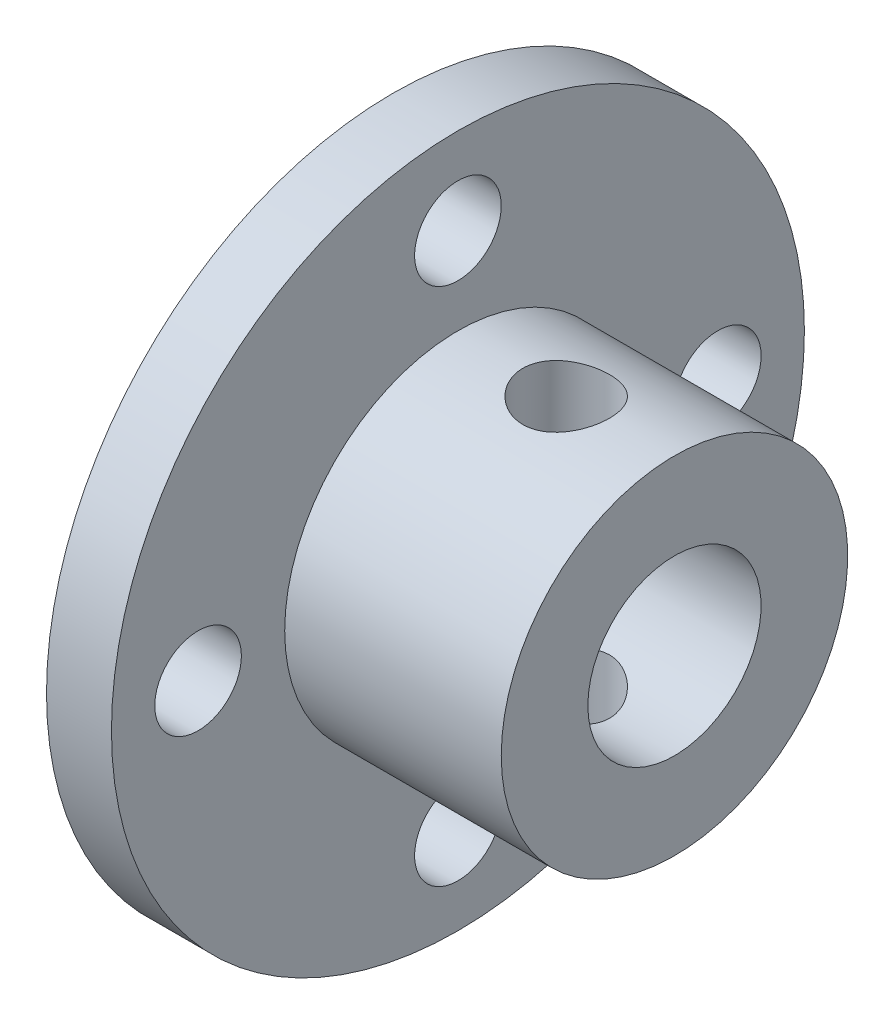
ISO-10303-21;
HEADER;
FILE_DESCRIPTION(('STEP AP214'),'2;1');
FILE_NAME('part.step','',(''),(''),'','','');
FILE_SCHEMA(('AUTOMOTIVE_DESIGN { 1 0 10303 214 1 1 1 1 }'));
ENDSEC;
DATA;
#1=APPLICATION_CONTEXT('core data for automotive mechanical design processes');
#2=APPLICATION_PROTOCOL_DEFINITION('international standard','automotive_design',2000,#1);
#3=PRODUCT_CONTEXT('',#1,'mechanical');
#4=PRODUCT('Part','Part','',(#3));
#5=PRODUCT_RELATED_PRODUCT_CATEGORY('part','',(#4));
#6=PRODUCT_DEFINITION_FORMATION('','',#4);
#7=PRODUCT_DEFINITION_CONTEXT('part definition',#1,'design');
#8=PRODUCT_DEFINITION('design','',#6,#7);
#9=PRODUCT_DEFINITION_SHAPE('','',#8);
#10=(LENGTH_UNIT() NAMED_UNIT(*) SI_UNIT(.MILLI.,.METRE.));
#11=(NAMED_UNIT(*) PLANE_ANGLE_UNIT() SI_UNIT($,.RADIAN.));
#12=(NAMED_UNIT(*) SI_UNIT($,.STERADIAN.) SOLID_ANGLE_UNIT());
#13=UNCERTAINTY_MEASURE_WITH_UNIT(LENGTH_MEASURE(1.E-05),#10,'distance_accuracy_value','');
#14=(GEOMETRIC_REPRESENTATION_CONTEXT(3) GLOBAL_UNCERTAINTY_ASSIGNED_CONTEXT((#13)) GLOBAL_UNIT_ASSIGNED_CONTEXT((#10,
#11,#12)) REPRESENTATION_CONTEXT('',''));
#15=CARTESIAN_POINT('',(0.,0.,0.));
#16=DIRECTION('',(0.,0.,1.));
#17=DIRECTION('',(1.,0.,0.));
#18=AXIS2_PLACEMENT_3D('',#15,#16,#17);
#19=CARTESIAN_POINT('',(0.,0.,0.));
#20=DIRECTION('',(-1.,0.,0.));
#21=DIRECTION('',(0.,0.,1.));
#22=AXIS2_PLACEMENT_3D('',#19,#20,#21);
#23=CYLINDRICAL_SURFACE('',#22,8.);
#24=CARTESIAN_POINT('',(3.,0.,0.));
#25=DIRECTION('',(-1.,0.,0.));
#26=DIRECTION('',(0.,0.,1.));
#27=AXIS2_PLACEMENT_3D('',#24,#25,#26);
#28=CIRCLE('',#27,8.);
#29=CARTESIAN_POINT('',(3.,0.,8.));
#30=VERTEX_POINT('',#29);
#31=EDGE_CURVE('E49',#30,#30,#28,.T.);
#32=ORIENTED_EDGE('',*,*,#31,.F.);
#33=EDGE_LOOP('',(#32));
#34=FACE_BOUND('',#33,.T.);
#35=CARTESIAN_POINT('',(13.,0.,4.44089209850063E-13));
#36=DIRECTION('',(-1.,0.,0.));
#37=DIRECTION('',(0.,0.,1.));
#38=AXIS2_PLACEMENT_3D('',#35,#36,#37);
#39=CIRCLE('',#38,8.);
#40=CARTESIAN_POINT('',(13.,0.,8.00000000000044));
#41=VERTEX_POINT('',#40);
#42=EDGE_CURVE('E104',#41,#41,#39,.T.);
#43=ORIENTED_EDGE('',*,*,#42,.T.);
#44=EDGE_LOOP('',(#43));
#45=FACE_BOUND('',#44,.T.);
#46=CARTESIAN_POINT('',(7.99999999999999,-7.74596669241484,-1.99999999999956));
#47=CARTESIAN_POINT('',(8.11044060074122,-7.74596880070287,-1.99999686287399));
#48=CARTESIAN_POINT('',(8.22091591894273,-7.74835444811688,-1.99082099639756));
#49=CARTESIAN_POINT('',(8.43869406253877,-7.75761489594063,-1.95441850037074));
#50=CARTESIAN_POINT('',(8.54599500357459,-7.76449230897306,-1.92718136539375));
#51=CARTESIAN_POINT('',(8.75424283054972,-7.7819097967692,-1.85559295970571));
#52=CARTESIAN_POINT('',(8.85519772430838,-7.79244514152373,-1.81126378228333));
#53=CARTESIAN_POINT('',(9.04824868203171,-7.81598553623014,-1.70681691300876));
#54=CARTESIAN_POINT('',(9.14034436966414,-7.82899069102793,-1.64669855084846));
#55=CARTESIAN_POINT('',(9.31508931620988,-7.85632573084501,-1.51096674184949));
#56=CARTESIAN_POINT('',(9.39751488028012,-7.87067678098435,-1.43506951016301));
#57=CARTESIAN_POINT('',(9.54860911548826,-7.89890300412242,-1.27054565127993));
#58=CARTESIAN_POINT('',(9.61727650049732,-7.91277813253111,-1.18191783534348));
#59=CARTESIAN_POINT('',(9.73982037410504,-7.93872332416466,-0.9929161608623));
#60=CARTESIAN_POINT('',(9.79347711052938,-7.95076549920481,-0.892395660955314));
#61=CARTESIAN_POINT('',(9.88304771532268,-7.97144649540795,-0.683410547433433));
#62=CARTESIAN_POINT('',(9.91896420153244,-7.98008581867479,-0.5749471086327));
#63=CARTESIAN_POINT('',(9.97131826766281,-7.99283807078543,-0.355487007002568));
#64=CARTESIAN_POINT('',(9.98813571546132,-7.99703915075451,-0.24458617563859));
#65=CARTESIAN_POINT('',(10.0030067034205,-8.0007487528584,-0.02146305540995));
#66=CARTESIAN_POINT('',(10.0010630177676,-8.00025796877365,0.0907590356305658));
#67=CARTESIAN_POINT('',(9.97874011979991,-7.99470475962829,0.310704494344771));
#68=CARTESIAN_POINT('',(9.95877093995711,-7.98974401872699,0.418472431202167));
#69=CARTESIAN_POINT('',(9.90162298396136,-7.97592669219884,0.629076494827395));
#70=CARTESIAN_POINT('',(9.86444329169803,-7.96706989918755,0.731912358740851));
#71=CARTESIAN_POINT('',(9.77359794345024,-7.94630007760716,0.930813407003751));
#72=CARTESIAN_POINT('',(9.71978636427061,-7.93436015756035,1.02680901953335));
#73=CARTESIAN_POINT('',(9.59731545670704,-7.90871923047713,1.20855124468161));
#74=CARTESIAN_POINT('',(9.52865354515147,-7.89501791721994,1.29429607017174));
#75=CARTESIAN_POINT('',(9.37623300641403,-7.86690971015617,1.45554807017066));
#76=CARTESIAN_POINT('',(9.29211608612178,-7.85249375620724,1.53071535815109));
#77=CARTESIAN_POINT('',(9.11232002116775,-7.82492034813355,1.66595275192636));
#78=CARTESIAN_POINT('',(9.01664033640704,-7.81176295284777,1.72602215209203));
#79=CARTESIAN_POINT('',(8.81576797268069,-7.78816397465319,1.82957625804527));
#80=CARTESIAN_POINT('',(8.71053141574944,-7.77773586980565,1.87297913394145));
#81=CARTESIAN_POINT('',(8.49393162553887,-7.76094912111955,1.94137124127313));
#82=CARTESIAN_POINT('',(8.38256970881343,-7.75458960648176,1.96636441310586));
#83=CARTESIAN_POINT('',(8.16003239878138,-7.74684284831313,1.99666371093218));
#84=CARTESIAN_POINT('',(8.0489297653362,-7.74532871274907,2.00247237913612));
#85=CARTESIAN_POINT('',(7.82734245073741,-7.7470987478482,1.9956135924129));
#86=CARTESIAN_POINT('',(7.71685771363894,-7.75038247681013,1.98294783827915));
#87=CARTESIAN_POINT('',(7.50150858803617,-7.76125665563649,1.93994037115011));
#88=CARTESIAN_POINT('',(7.39658181874325,-7.76877576187491,1.90989125462558));
#89=CARTESIAN_POINT('',(7.19325483371853,-7.78720574616761,1.83329446533707));
#90=CARTESIAN_POINT('',(7.09485539275556,-7.79811702598891,1.7867448381708));
#91=CARTESIAN_POINT('',(6.90524697770603,-7.82236909674612,1.67741653434998));
#92=CARTESIAN_POINT('',(6.81421692796556,-7.83575334885306,1.61433740306902));
#93=CARTESIAN_POINT('',(6.64384930975899,-7.86333666457363,1.47412058586927));
#94=CARTESIAN_POINT('',(6.56451366667992,-7.87753586182775,1.39698058961131));
#95=CARTESIAN_POINT('',(6.41775116594319,-7.90557922425286,1.2285254419699));
#96=CARTESIAN_POINT('',(6.35067194996099,-7.91940561649463,1.13690390506359));
#97=CARTESIAN_POINT('',(6.23285130643906,-7.94477773290982,0.943405365389774));
#98=CARTESIAN_POINT('',(6.18210902671342,-7.95632357603169,0.841528897915679));
#99=CARTESIAN_POINT('',(6.09884317237765,-7.97576092590652,0.631116403462718));
#100=CARTESIAN_POINT('',(6.06618857249682,-7.98367864017923,0.522634762056264));
#101=CARTESIAN_POINT('',(6.01963173231334,-7.99508234716631,0.301499520638069));
#102=CARTESIAN_POINT('',(6.00572587300875,-7.99856919514738,0.188846730082928));
#103=CARTESIAN_POINT('',(5.99726482084892,-8.00068338817614,-0.0341670528862561));
#104=CARTESIAN_POINT('',(6.00219658180928,-7.99943957759978,-0.144507653931702));
#105=CARTESIAN_POINT('',(6.03009565458877,-7.99251792914887,-0.362734992829298));
#106=CARTESIAN_POINT('',(6.05306243002629,-7.98684022314339,-0.470621803561743));
#107=CARTESIAN_POINT('',(6.11610443954176,-7.97170865707779,-0.680342071289449));
#108=CARTESIAN_POINT('',(6.15608690662899,-7.96227529004787,-0.782204989161555));
#109=CARTESIAN_POINT('',(6.25194115803935,-7.94062577827317,-0.977834106083168));
#110=CARTESIAN_POINT('',(6.30781494534095,-7.92840928277515,-1.07159928253135));
#111=CARTESIAN_POINT('',(6.43543046799227,-7.90214499360576,-1.25080385684661));
#112=CARTESIAN_POINT('',(6.50752028580793,-7.88806033883334,-1.33598997659644));
#113=CARTESIAN_POINT('',(6.66484570395497,-7.85981298114383,-1.49323004054678));
#114=CARTESIAN_POINT('',(6.75008463222236,-7.84565025934604,-1.56528065015319));
#115=CARTESIAN_POINT('',(6.93320282837885,-7.81854951691008,-1.69552405294364));
#116=CARTESIAN_POINT('',(7.03128824673059,-7.80563927346589,-1.75343323883244));
#117=CARTESIAN_POINT('',(7.23611097974978,-7.78287910989664,-1.85185379317041));
#118=CARTESIAN_POINT('',(7.34284193218774,-7.77302696466426,-1.89237781950386));
#119=CARTESIAN_POINT('',(7.5411540236703,-7.75903817501476,-1.94884505714159));
#120=CARTESIAN_POINT('',(7.63178632877227,-7.75417326007009,-1.96798634119331));
#121=CARTESIAN_POINT('',(7.81493773799538,-7.74763677165252,-1.99356458514308));
#122=CARTESIAN_POINT('',(7.90745668048881,-7.74596492578217,-2.00000262874308));
#123=CARTESIAN_POINT('',(7.99999999999999,-7.74596669241484,-1.99999999999956));
#124=B_SPLINE_CURVE_WITH_KNOTS('',3,(#46,#47,#48,#49,#50,#51,#52,#53,#54,#55,#56,#57,#58,#59,
#60,#61,#62,#63,#64,#65,#66,#67,#68,#69,#70,#71,#72,#73,#74,#75,#76,#77,#78,#79,#80,#81,#82,#83,
#84,#85,#86,#87,#88,#89,#90,#91,#92,#93,#94,#95,#96,#97,#98,#99,#100,#101,#102,#103,#104,#105,
#106,#107,#108,#109,#110,#111,#112,#113,#114,#115,#116,#117,#118,#119,#120,#121,#122,#123),
.UNSPECIFIED.,.T.,.F.,(4,2,2,2,2,2,2,2,2,2,2,2,2,2,2,2,2,2,2,2,2,2,2,2,2,2,2,2,2,2,2,2,2,2,2,2,
2,2,4),(0.,0.330981953388857,0.662156593142811,0.99290458173268,1.32366661404369,
1.66099163354396,1.9983481718394,2.34041197118387,2.68242527877727,3.01751000796287,
3.35254518932781,3.68014610151123,4.00776445379801,4.33834299403568,4.66897908375175,
5.00856373257546,5.3481642495984,5.68941145606728,6.03058560103644,6.36274859809379,
6.69488101747054,7.0215792400737,7.34831617137122,7.68146276687317,8.01466415108038,
8.35620264772253,8.69772332575631,9.03673658245535,9.37568439127227,9.70546756901979,
10.0352409390162,10.363239012478,10.691278445905,11.0271767726569,11.3631602525244,
11.7054118182897,12.0474137709606,12.3247826174463,12.6021278008238),.UNSPECIFIED.);
#125=CARTESIAN_POINT('',(7.99999999999999,-7.74596669241484,-1.99999999999956));
#126=VERTEX_POINT('',#125);
#127=EDGE_CURVE('E73',#126,#126,#124,.T.);
#128=ORIENTED_EDGE('',*,*,#127,.F.);
#129=EDGE_LOOP('',(#128));
#130=FACE_BOUND('',#129,.T.);
#131=CARTESIAN_POINT('',(7.99999999999998,7.74596669241483,-2.));
#132=CARTESIAN_POINT('',(7.88955939925875,7.74596880070287,-1.99999686287449));
#133=CARTESIAN_POINT('',(7.77908408105723,7.74835444811689,-1.9908209963978));
#134=CARTESIAN_POINT('',(7.56130593746124,7.75761489594063,-1.95441850037046));
#135=CARTESIAN_POINT('',(7.45400499642546,7.76449230897305,-1.9271813653932));
#136=CARTESIAN_POINT('',(7.24575716945029,7.78190979676919,-1.85559295970517));
#137=CARTESIAN_POINT('',(7.14480227569155,7.79244514152375,-1.81126378228307));
#138=CARTESIAN_POINT('',(6.95175131796816,7.81598553623018,-1.70681691300877));
#139=CARTESIAN_POINT('',(6.85965563033578,7.82899069102794,-1.64669855084847));
#140=CARTESIAN_POINT('',(6.68491068379021,7.856325730845,-1.51096674184948));
#141=CARTESIAN_POINT('',(6.60248511972011,7.87067678098433,-1.43506951016299));
#142=CARTESIAN_POINT('',(6.4513908845119,7.89890300412241,-1.2705456512801));
#143=CARTESIAN_POINT('',(6.38272349950265,7.91277813253112,-1.18191783534386));
#144=CARTESIAN_POINT('',(6.26017962589491,7.93872332416467,-0.992916160862716));
#145=CARTESIAN_POINT('',(6.20652288947079,7.9507654992048,-0.892395660955541));
#146=CARTESIAN_POINT('',(6.11695228467753,7.97144649540793,-0.683410547433473));
#147=CARTESIAN_POINT('',(6.08103579846759,7.98008581867477,-0.574947108632742));
#148=CARTESIAN_POINT('',(6.02868173233718,7.99283807078542,-0.355487007002586));
#149=CARTESIAN_POINT('',(6.0118642845388,7.99703915075452,-0.244586175638586));
#150=CARTESIAN_POINT('',(5.99699329657962,8.0007487528584,-0.0214630554099279));
#151=CARTESIAN_POINT('',(5.99893698223237,8.00025796877363,0.0907590356305845));
#152=CARTESIAN_POINT('',(6.02125988020009,7.99470475962827,0.310704494344747));
#153=CARTESIAN_POINT('',(6.04122906004303,7.98974401872699,0.418472431202105));
#154=CARTESIAN_POINT('',(6.09837701603873,7.97592669219884,0.629076494827355));
#155=CARTESIAN_POINT('',(6.13555670830188,7.96706989918755,0.731912358740872));
#156=CARTESIAN_POINT('',(6.22640205654965,7.94630007760715,0.930813407003723));
#157=CARTESIAN_POINT('',(6.28021363572944,7.93436015756037,1.02680901953321));
#158=CARTESIAN_POINT('',(6.40268454329298,7.90871923047715,1.2085512446815));
#159=CARTESIAN_POINT('',(6.47134645484835,7.89501791721994,1.29429607017176));
#160=CARTESIAN_POINT('',(6.62376699358571,7.86690971015617,1.45554807017065));
#161=CARTESIAN_POINT('',(6.7078839138781,7.85249375620727,1.53071535815092));
#162=CARTESIAN_POINT('',(6.88767997883216,7.82492034813358,1.66595275192619));
#163=CARTESIAN_POINT('',(6.98335966359276,7.81176295284777,1.72602215209204));
#164=CARTESIAN_POINT('',(7.18423202731909,7.78816397465317,1.82957625804528));
#165=CARTESIAN_POINT('',(7.28946858425043,7.77773586980566,1.87297913394127));
#166=CARTESIAN_POINT('',(7.50606837446102,7.76094912111957,1.94137124127316));
#167=CARTESIAN_POINT('',(7.61743029118638,7.75458960648176,1.96636441310628));
#168=CARTESIAN_POINT('',(7.83996760121839,7.74684284831312,1.99666371093264));
#169=CARTESIAN_POINT('',(7.95107023466359,7.74532871274907,2.00247237913627));
#170=CARTESIAN_POINT('',(8.1726575492624,7.7470987478482,1.99561359241277));
#171=CARTESIAN_POINT('',(8.28314228636084,7.75038247681013,1.98294783827908));
#172=CARTESIAN_POINT('',(8.49849141196367,7.76125665563648,1.93994037115018));
#173=CARTESIAN_POINT('',(8.60341818125664,7.76877576187489,1.90989125462574));
#174=CARTESIAN_POINT('',(8.80674516628133,7.78720574616758,1.8332944653371));
#175=CARTESIAN_POINT('',(8.90514460724421,7.79811702598889,1.78674483817059));
#176=CARTESIAN_POINT('',(9.09475302229373,7.82236909674609,1.67741653434977));
#177=CARTESIAN_POINT('',(9.1857830720343,7.83575334885301,1.61433740306905));
#178=CARTESIAN_POINT('',(9.35615069024096,7.86333666457361,1.47412058586961));
#179=CARTESIAN_POINT('',(9.43548633332001,7.87753586182775,1.39698058961171));
#180=CARTESIAN_POINT('',(9.58224883405678,7.90557922425287,1.22852544197029));
#181=CARTESIAN_POINT('',(9.64932805003902,7.91940561649461,1.13690390506389));
#182=CARTESIAN_POINT('',(9.76714869356094,7.94477773290978,0.943405365389876));
#183=CARTESIAN_POINT('',(9.81789097328653,7.95632357603167,0.84152889791566));
#184=CARTESIAN_POINT('',(9.90115682762236,7.97576092590652,0.631116403462615));
#185=CARTESIAN_POINT('',(9.93381142750332,7.98367864017923,0.522634762056206));
#186=CARTESIAN_POINT('',(9.98036826768679,7.99508234716631,0.301499520638058));
#187=CARTESIAN_POINT('',(9.99427412699123,7.99856919514738,0.188846730082919));
#188=CARTESIAN_POINT('',(10.0027351791511,8.00068338817613,-0.0341670528862876));
#189=CARTESIAN_POINT('',(9.99780341819083,7.99943957759978,-0.144507653931759));
#190=CARTESIAN_POINT('',(9.96990434541135,7.99251792914887,-0.362734992829381));
#191=CARTESIAN_POINT('',(9.94693756997372,7.98684022314338,-0.470621803561826));
#192=CARTESIAN_POINT('',(9.88389556045824,7.97170865707778,-0.680342071289535));
#193=CARTESIAN_POINT('',(9.84391309337111,7.96227529004786,-0.782204989161648));
#194=CARTESIAN_POINT('',(9.74805884196075,7.94062577827317,-0.97783410608317));
#195=CARTESIAN_POINT('',(9.69218505465904,7.92840928277515,-1.07159928253125));
#196=CARTESIAN_POINT('',(9.56456953200771,7.90214499360575,-1.25080385684653));
#197=CARTESIAN_POINT('',(9.49247971419214,7.88806033883333,-1.33598997659646));
#198=CARTESIAN_POINT('',(9.33515429604511,7.85981298114382,-1.49323004054684));
#199=CARTESIAN_POINT('',(9.24991536777765,7.84565025934604,-1.5652806501532));
#200=CARTESIAN_POINT('',(9.06679717162113,7.81854951691007,-1.69552405294362));
#201=CARTESIAN_POINT('',(8.96871175326943,7.80563927346588,-1.75343323883247));
#202=CARTESIAN_POINT('',(8.76388902025026,7.78287910989663,-1.85185379317047));
#203=CARTESIAN_POINT('',(8.65715806781226,7.77302696466425,-1.8923778195039));
#204=CARTESIAN_POINT('',(8.45884597632965,7.75903817501476,-1.94884505714156));
#205=CARTESIAN_POINT('',(8.36821367122766,7.75417326007009,-1.96798634119323));
#206=CARTESIAN_POINT('',(8.18506226200455,7.74763677165251,-1.99356458514322));
#207=CARTESIAN_POINT('',(8.09254331951115,7.74596492578216,-2.00000262874348));
#208=CARTESIAN_POINT('',(7.99999999999998,7.74596669241483,-2.));
#209=B_SPLINE_CURVE_WITH_KNOTS('',3,(#131,#132,#133,#134,#135,#136,#137,#138,#139,#140,#141,
#142,#143,#144,#145,#146,#147,#148,#149,#150,#151,#152,#153,#154,#155,#156,#157,#158,#159,#160,
#161,#162,#163,#164,#165,#166,#167,#168,#169,#170,#171,#172,#173,#174,#175,#176,#177,#178,#179,
#180,#181,#182,#183,#184,#185,#186,#187,#188,#189,#190,#191,#192,#193,#194,#195,#196,#197,#198,
#199,#200,#201,#202,#203,#204,#205,#206,#207,#208),.UNSPECIFIED.,.T.,.F.,(4,2,2,2,2,2,2,2,2,2,2,
2,2,2,2,2,2,2,2,2,2,2,2,2,2,2,2,2,2,2,2,2,2,2,2,2,2,2,4),(0.,0.330981953388862,
0.662156593142953,0.992904581732757,1.3236666140436,1.66099163354367,1.99834817183895,
2.34041197118361,2.68242527877719,3.01751000796279,3.35254518932771,3.6801461015111,
4.00776445379785,4.33834299403548,4.66897908375148,5.00856373257516,5.34816424959811,
5.68941145606706,6.03058560103623,6.36274859809356,6.69488101747033,7.02157924007353,
7.34831617137111,7.68146276687293,8.01466415107994,8.35620264772233,8.69772332575641,
9.03673658245541,9.37568439127228,9.70546756901987,10.0352409390163,10.3632390124781,
10.6912784459049,11.0271767726569,11.3631602525244,11.7054118182897,12.0474137709607,
12.3247826174464,12.6021278008239),.UNSPECIFIED.);
#210=CARTESIAN_POINT('',(7.99999999999998,7.74596669241483,-2.));
#211=VERTEX_POINT('',#210);
#212=EDGE_CURVE('E78',#211,#211,#209,.T.);
#213=ORIENTED_EDGE('',*,*,#212,.F.);
#214=EDGE_LOOP('',(#213));
#215=FACE_BOUND('',#214,.T.);
#216=ADVANCED_FACE('F32',(#34,#45,#130,#215),#23,.T.);
#217=CARTESIAN_POINT('',(0.,0.,0.));
#218=DIRECTION('',(-1.,0.,0.));
#219=DIRECTION('',(0.,0.,1.));
#220=AXIS2_PLACEMENT_3D('',#217,#218,#219);
#221=CYLINDRICAL_SURFACE('',#220,4.);
#222=CARTESIAN_POINT('',(13.,0.,4.44089209850063E-13));
#223=DIRECTION('',(-1.,0.,0.));
#224=DIRECTION('',(0.,0.,1.));
#225=AXIS2_PLACEMENT_3D('',#222,#223,#224);
#226=CIRCLE('',#225,4.);
#227=CARTESIAN_POINT('',(13.,0.,4.00000000000044));
#228=VERTEX_POINT('',#227);
#229=EDGE_CURVE('E106',#228,#228,#226,.T.);
#230=ORIENTED_EDGE('',*,*,#229,.F.);
#231=EDGE_LOOP('',(#230));
#232=FACE_BOUND('',#231,.T.);
#233=CARTESIAN_POINT('',(0.,0.,0.));
#234=DIRECTION('',(-1.,0.,0.));
#235=DIRECTION('',(0.,0.,1.));
#236=AXIS2_PLACEMENT_3D('',#233,#234,#235);
#237=CIRCLE('',#236,4.);
#238=CARTESIAN_POINT('',(0.,0.,4.));
#239=VERTEX_POINT('',#238);
#240=EDGE_CURVE('E111',#239,#239,#237,.T.);
#241=ORIENTED_EDGE('',*,*,#240,.T.);
#242=EDGE_LOOP('',(#241));
#243=FACE_BOUND('',#242,.T.);
#244=CARTESIAN_POINT('',(7.99999999999999,-3.46410161513776,-1.99999999999911));
#245=CARTESIAN_POINT('',(7.89578679452564,-3.46411185715869,-1.99999158748676));
#246=CARTESIAN_POINT('',(7.79143782346617,-3.46887633544998,-1.99179963610374));
#247=CARTESIAN_POINT('',(7.58594482276934,-3.48724701669104,-1.95944672580023));
#248=CARTESIAN_POINT('',(7.48480799675218,-3.50087179788187,-1.93525221095624));
#249=CARTESIAN_POINT('',(7.28909684355312,-3.53498701489999,-1.87219981597982));
#250=CARTESIAN_POINT('',(7.19449074115093,-3.55544089069187,-1.83341988295914));
#251=CARTESIAN_POINT('',(7.01315154952399,-3.60085327291154,-1.74253507245109));
#252=CARTESIAN_POINT('',(6.92641888656321,-3.62581202301257,-1.69042947410131));
#253=CARTESIAN_POINT('',(6.75538855686657,-3.67993738819287,-1.56933307453796));
#254=CARTESIAN_POINT('',(6.67188173240835,-3.70928127465116,-1.49930407053507));
#255=CARTESIAN_POINT('',(6.51718321942956,-3.76743965382136,-1.34650761698155));
#256=CARTESIAN_POINT('',(6.44599767379606,-3.79625387610261,-1.26373385204796));
#257=CARTESIAN_POINT('',(6.31326569881154,-3.85242953961657,-1.08097912631225));
#258=CARTESIAN_POINT('',(6.25269246457685,-3.87956212851249,-0.980214377886796));
#259=CARTESIAN_POINT('',(6.14971829321305,-3.92701512184175,-0.768314053336745));
#260=CARTESIAN_POINT('',(6.10730588764919,-3.94733982363634,-0.657185076311957));
#261=CARTESIAN_POINT('',(6.0449906774688,-3.97760922492052,-0.436089887818896));
#262=CARTESIAN_POINT('',(6.023700947308,-3.98818960442739,-0.326603580968829));
#263=CARTESIAN_POINT('',(5.99966776263109,-4.0001516769118,-0.10514125740454));
#264=CARTESIAN_POINT('',(5.99691308640374,-4.00153893568937,0.00683321168521747));
#265=CARTESIAN_POINT('',(6.00949334794511,-3.99525963833124,0.219665048849655));
#266=CARTESIAN_POINT('',(6.02327603104366,-3.98836991784377,0.320642398354284));
#267=CARTESIAN_POINT('',(6.06576168780814,-3.96748490519434,0.518627543836408));
#268=CARTESIAN_POINT('',(6.09446577795209,-3.95348908132776,0.615635042188132));
#269=CARTESIAN_POINT('',(6.16616513217999,-3.91943166575323,0.804618783139769));
#270=CARTESIAN_POINT('',(6.20935262634437,-3.89928883058387,0.896506847030875));
#271=CARTESIAN_POINT('',(6.308526832403,-3.85475291973357,1.07195360302726));
#272=CARTESIAN_POINT('',(6.36451812660462,-3.83035832314969,1.15550929767812));
#273=CARTESIAN_POINT('',(6.49379070306591,-3.77688788798463,1.32034732179719));
#274=CARTESIAN_POINT('',(6.56820605665196,-3.74758751996338,1.40066815005926));
#275=CARTESIAN_POINT('',(6.72917944986034,-3.68908681173608,1.54820874059572));
#276=CARTESIAN_POINT('',(6.81574674454811,-3.65988656531257,1.61541842314851));
#277=CARTESIAN_POINT('',(7.00529638484808,-3.60288312184968,1.73901066928452));
#278=CARTESIAN_POINT('',(7.10897204610825,-3.57528639981396,1.79443462995636));
#279=CARTESIAN_POINT('',(7.32587534271781,-3.52750900557136,1.88663822600289));
#280=CARTESIAN_POINT('',(7.43909286603499,-3.50732060092139,1.92343731642223));
#281=CARTESIAN_POINT('',(7.66242902256548,-3.47889271634066,1.97436042205054));
#282=CARTESIAN_POINT('',(7.77208223808699,-3.46983311696967,1.99005024424039));
#283=CARTESIAN_POINT('',(7.99280268303297,-3.46235838723195,2.00303389322328));
#284=CARTESIAN_POINT('',(8.10386885823946,-3.46393573778626,2.00034071463047));
#285=CARTESIAN_POINT('',(8.31130783715738,-3.47668673081168,1.97807208668843));
#286=CARTESIAN_POINT('',(8.4079589022158,-3.48679175013283,1.9603756334255));
#287=CARTESIAN_POINT('',(8.59673557254196,-3.51388043102656,1.91139256926524));
#288=CARTESIAN_POINT('',(8.68885970149333,-3.53086632010066,1.88010155724732));
#289=CARTESIAN_POINT('',(8.87082266180501,-3.57072444159315,1.80329517720976));
#290=CARTESIAN_POINT('',(8.96035803370612,-3.59383286486106,1.75718812738564));
#291=CARTESIAN_POINT('',(9.13093854307913,-3.64312238994479,1.65257412803228));
#292=CARTESIAN_POINT('',(9.21197928703044,-3.66930506710297,1.59406080866539));
#293=CARTESIAN_POINT('',(9.37395753504247,-3.72575996912671,1.45767433439746));
#294=CARTESIAN_POINT('',(9.45359430141767,-3.75613166308546,1.37829054462796));
#295=CARTESIAN_POINT('',(9.5988244760047,-3.81468469955776,1.20680899079975));
#296=CARTESIAN_POINT('',(9.6644131405268,-3.84286530015462,1.11470694932073));
#297=CARTESIAN_POINT('',(9.7811474518327,-3.89482723381873,0.917070725108888));
#298=CARTESIAN_POINT('',(9.83186623616677,-3.91847283343875,0.811246195113201));
#299=CARTESIAN_POINT('',(9.91427580796961,-3.95766709918763,0.59104472931838));
#300=CARTESIAN_POINT('',(9.94598330368407,-3.97322287353394,0.476675402918097));
#301=CARTESIAN_POINT('',(9.98673712748514,-3.99335016363177,0.253959364540156));
#302=CARTESIAN_POINT('',(9.99759574866434,-3.99879855814271,0.146022887268716));
#303=CARTESIAN_POINT('',(10.0016865339957,-4.00084260752372,-0.0702519714694831));
#304=CARTESIAN_POINT('',(9.99492486852887,-3.99744136141632,-0.178590198981128));
#305=CARTESIAN_POINT('',(9.96516717568357,-3.9826793766851,-0.385075986136437));
#306=CARTESIAN_POINT('',(9.94327026269093,-3.97185789309446,-0.483424641057081));
#307=CARTESIAN_POINT('',(9.88534604019335,-3.94384187353391,-0.67489189893141));
#308=CARTESIAN_POINT('',(9.84931670429314,-3.92664642364425,-0.768009749669716));
#309=CARTESIAN_POINT('',(9.7625457450086,-3.88651861393183,-0.950846833596679));
#310=CARTESIAN_POINT('',(9.71124078024807,-3.86337234005412,-1.04025036572274));
#311=CARTESIAN_POINT('',(9.59608471188182,-3.81376266676033,-1.20954920326797));
#312=CARTESIAN_POINT('',(9.53222784589841,-3.78729774583426,-1.28944011444282));
#313=CARTESIAN_POINT('',(9.38640336444056,-3.73057218840583,-1.44582833859453));
#314=CARTESIAN_POINT('',(9.30326581919962,-3.7001959172609,-1.52119665879156));
#315=CARTESIAN_POINT('',(9.12510777169385,-3.64126158628586,-1.65732528393981));
#316=CARTESIAN_POINT('',(9.03007686863952,-3.61270515130786,-1.71807266521237));
#317=CARTESIAN_POINT('',(8.82669110586975,-3.5599918625675,-1.82486714716807));
#318=CARTESIAN_POINT('',(8.71801008926458,-3.53600256268545,-1.87038902381895));
#319=CARTESIAN_POINT('',(8.54942188036881,-3.50696218132394,-1.92395929504757));
#320=CARTESIAN_POINT('',(8.49235217940907,-3.4984438932943,-1.93935666147915));
#321=CARTESIAN_POINT('',(8.37676744249966,-3.48406059323549,-1.96508069805018));
#322=CARTESIAN_POINT('',(8.31825344724571,-3.47819372636044,-1.97541091343294));
#323=CARTESIAN_POINT('',(8.21639921075272,-3.47059023668763,-1.98872932961223));
#324=CARTESIAN_POINT('',(8.17326694274991,-3.4681638973184,-1.99295091983764));
#325=CARTESIAN_POINT('',(8.08676430690708,-3.46491740045203,-1.99858810035541));
#326=CARTESIAN_POINT('',(8.04339392333328,-3.464097350405,-2.00000350293249));
#327=CARTESIAN_POINT('',(7.99999999999999,-3.46410161513776,-1.99999999999911));
#328=B_SPLINE_CURVE_WITH_KNOTS('',3,(#244,#245,#246,#247,#248,#249,#250,#251,#252,#253,#254,
#255,#256,#257,#258,#259,#260,#261,#262,#263,#264,#265,#266,#267,#268,#269,#270,#271,#272,#273,
#274,#275,#276,#277,#278,#279,#280,#281,#282,#283,#284,#285,#286,#287,#288,#289,#290,#291,#292,
#293,#294,#295,#296,#297,#298,#299,#300,#301,#302,#303,#304,#305,#306,#307,#308,#309,#310,#311,
#312,#313,#314,#315,#316,#317,#318,#319,#320,#321,#322,#323,#324,#325,#326,#327),.UNSPECIFIED.,
.T.,.F.,(4,2,2,2,2,2,2,2,2,2,2,2,2,2,2,2,2,2,2,2,2,2,2,2,2,2,2,2,2,2,2,2,2,2,2,2,2,2,2,2,2,4),
(0.,0.312464245189468,0.625585785649551,0.93705719186134,1.24854545093069,1.58572462503698,
1.92307142172807,2.28315784481569,2.64301653931797,2.97726969939888,3.31132047376102,
3.6163219497312,3.92134625038977,4.23059069466376,4.53994598704637,4.87854382917841,
5.21740096495871,5.57777683462943,5.93777548427463,6.26924581712477,6.60048186380801,
6.89548366852113,7.19058104876197,7.4993459281624,7.80826972444152,8.15613487165267,
8.50411729960428,8.86128362829979,9.21813559621616,9.5422454078304,9.86624173592003,
10.1688884974707,10.4715786702813,10.7872150144303,11.1029966020551,11.4502048370421,
11.797718856944,12.1562149808131,12.3351395323574,12.5139387197528,12.6440387634037,
12.7741475095883),.UNSPECIFIED.);
#329=CARTESIAN_POINT('',(7.99999999999999,-3.46410161513776,-1.99999999999911));
#330=VERTEX_POINT('',#329);
#331=EDGE_CURVE('E52',#330,#330,#328,.T.);
#332=ORIENTED_EDGE('',*,*,#331,.F.);
#333=EDGE_LOOP('',(#332));
#334=FACE_BOUND('',#333,.T.);
#335=CARTESIAN_POINT('',(7.99999999999999,3.46410161513776,-1.99999999999911));
#336=CARTESIAN_POINT('',(8.10421320547434,3.46411185715868,-1.99999158748675));
#337=CARTESIAN_POINT('',(8.20856217653382,3.46887633544997,-1.99179963610376));
#338=CARTESIAN_POINT('',(8.41405517723064,3.48724701669103,-1.95944672580025));
#339=CARTESIAN_POINT('',(8.5151920032478,3.50087179788186,-1.93525221095623));
#340=CARTESIAN_POINT('',(8.71090315644687,3.53498701489997,-1.87219981597982));
#341=CARTESIAN_POINT('',(8.8055092588491,3.55544089069184,-1.83341988295919));
#342=CARTESIAN_POINT('',(8.98684845047603,3.60085327291152,-1.74253507245114));
#343=CARTESIAN_POINT('',(9.07358111343677,3.62581202301257,-1.69042947410131));
#344=CARTESIAN_POINT('',(9.24461144313343,3.67993738819287,-1.56933307453796));
#345=CARTESIAN_POINT('',(9.32811826759172,3.70928127465114,-1.49930407053513));
#346=CARTESIAN_POINT('',(9.4828167805705,3.76743965382133,-1.34650761698161));
#347=CARTESIAN_POINT('',(9.55400232620392,3.79625387610258,-1.26373385204796));
#348=CARTESIAN_POINT('',(9.68673430118853,3.85242953961658,-1.08097912631219));
#349=CARTESIAN_POINT('',(9.74730753542337,3.87956212851254,-0.980214377886722));
#350=CARTESIAN_POINT('',(9.85028170678714,3.92701512184178,-0.768314053336484));
#351=CARTESIAN_POINT('',(9.89269411235079,3.94733982363633,-0.657185076311515));
#352=CARTESIAN_POINT('',(9.95500932253119,3.97760922492051,-0.436089887818326));
#353=CARTESIAN_POINT('',(9.97629905269217,3.98818960442741,-0.326603580968308));
#354=CARTESIAN_POINT('',(10.0003322373691,4.00015167691183,-0.10514125740408));
#355=CARTESIAN_POINT('',(10.0030869135963,4.00153893568937,0.00683321168566488));
#356=CARTESIAN_POINT('',(9.99050665205488,3.99525963833123,0.21966504884997));
#357=CARTESIAN_POINT('',(9.97672396895648,3.98836991784378,0.32064239835448));
#358=CARTESIAN_POINT('',(9.93423831219196,3.96748490519432,0.51862754383627));
#359=CARTESIAN_POINT('',(9.90553422204783,3.95348908132771,0.61563504218778));
#360=CARTESIAN_POINT('',(9.83383486782004,3.91943166575322,0.804618783139377));
#361=CARTESIAN_POINT('',(9.79064737365592,3.89928883058393,0.896506847030651));
#362=CARTESIAN_POINT('',(9.69147316759723,3.85475291973363,1.07195360302699));
#363=CARTESIAN_POINT('',(9.6354818733953,3.8303583231497,1.15550929767765));
#364=CARTESIAN_POINT('',(9.50620929693392,3.77688788798459,1.32034732179681));
#365=CARTESIAN_POINT('',(9.43179394334814,3.74758751996336,1.4006681500592));
#366=CARTESIAN_POINT('',(9.27082055013978,3.68908681173609,1.54820874059581));
#367=CARTESIAN_POINT('',(9.18425325545177,3.65988656531258,1.6154184231484));
#368=CARTESIAN_POINT('',(8.99470361515165,3.60288312184966,1.73901066928439));
#369=CARTESIAN_POINT('',(8.8910279538916,3.57528639981391,1.79443462995642));
#370=CARTESIAN_POINT('',(8.67412465728209,3.5275090055713,1.88663822600304));
#371=CARTESIAN_POINT('',(8.56090713396484,3.50732060092136,1.92343731642227));
#372=CARTESIAN_POINT('',(8.33757097743429,3.47889271634066,1.9743604220505));
#373=CARTESIAN_POINT('',(8.2279177619128,3.46983311696966,1.9900502442404));
#374=CARTESIAN_POINT('',(8.00719731696683,3.46235838723193,2.00303389322331));
#375=CARTESIAN_POINT('',(7.89613114176032,3.46393573778622,2.00034071463051));
#376=CARTESIAN_POINT('',(7.68869216284243,3.47668673081169,1.9780720866884));
#377=CARTESIAN_POINT('',(7.59204109778403,3.48679175013288,1.96037563342541));
#378=CARTESIAN_POINT('',(7.40326442745785,3.5138804310266,1.91139256926518));
#379=CARTESIAN_POINT('',(7.31114029850644,3.53086632010063,1.88010155724734));
#380=CARTESIAN_POINT('',(7.12917733819481,3.57072444159314,1.80329517720974));
#381=CARTESIAN_POINT('',(7.0396419662938,3.59383286486112,1.75718812738548));
#382=CARTESIAN_POINT('',(6.86906145692077,3.64312238994486,1.65257412803218));
#383=CARTESIAN_POINT('',(6.78802071296933,3.66930506710298,1.59406080866547));
#384=CARTESIAN_POINT('',(6.62604246495727,3.72575996912672,1.45767433439757));
#385=CARTESIAN_POINT('',(6.54640569858222,3.75613166308555,1.37829054462786));
#386=CARTESIAN_POINT('',(6.40117552399527,3.81468469955783,1.20680899079939));
#387=CARTESIAN_POINT('',(6.3355868594731,3.84286530015462,1.11470694932034));
#388=CARTESIAN_POINT('',(6.21885254816724,3.89482723381871,0.917070725108503));
#389=CARTESIAN_POINT('',(6.16813376383325,3.91847283343879,0.811246195112874));
#390=CARTESIAN_POINT('',(6.08572419203043,3.95766709918769,0.591044729318203));
#391=CARTESIAN_POINT('',(6.0540166963159,3.97322287353395,0.476675402918014));
#392=CARTESIAN_POINT('',(6.01326287251487,3.99335016363176,0.253959364540142));
#393=CARTESIAN_POINT('',(6.00240425133579,3.99879855814271,0.146022887268676));
#394=CARTESIAN_POINT('',(5.99831346600438,4.00084260752373,-0.0702519714695683));
#395=CARTESIAN_POINT('',(6.00507513147113,3.99744136141632,-0.178590198981232));
#396=CARTESIAN_POINT('',(6.03483282431641,3.98267937668511,-0.385075986136448));
#397=CARTESIAN_POINT('',(6.05672973730912,3.9718578930945,-0.483424641056985));
#398=CARTESIAN_POINT('',(6.11465395980673,3.94384187353393,-0.674891898931125));
#399=CARTESIAN_POINT('',(6.1506832957069,3.92664642364423,-0.768009749669347));
#400=CARTESIAN_POINT('',(6.23745425499145,3.88651861393181,-0.950846833596343));
#401=CARTESIAN_POINT('',(6.28875921975205,3.86337234005412,-1.0402503657225));
#402=CARTESIAN_POINT('',(6.40391528811824,3.81376266676036,-1.2095492032681));
#403=CARTESIAN_POINT('',(6.46777215410152,3.78729774583428,-1.28944011444321));
#404=CARTESIAN_POINT('',(6.6135966355594,3.73057218840584,-1.44582833859492));
#405=CARTESIAN_POINT('',(6.69673418080054,3.70019591726088,-1.52119665879167));
#406=CARTESIAN_POINT('',(6.87489222830635,3.64126158628584,-1.65732528393978));
#407=CARTESIAN_POINT('',(6.96992313136054,3.61270515130785,-1.71807266521249));
#408=CARTESIAN_POINT('',(7.17330889413021,3.55999186256751,-1.82486714716819));
#409=CARTESIAN_POINT('',(7.28198991073544,3.53600256268546,-1.87038902381892));
#410=CARTESIAN_POINT('',(7.45057811963122,3.50696218132396,-1.92395929504753));
#411=CARTESIAN_POINT('',(7.50764782059094,3.49844389329433,-1.93935666147914));
#412=CARTESIAN_POINT('',(7.62323255750034,3.4840605932355,-1.96508069805013));
#413=CARTESIAN_POINT('',(7.68174655275429,3.47819372636042,-1.97541091343281));
#414=CARTESIAN_POINT('',(7.78360078924728,3.47059023668761,-1.98872932961214));
#415=CARTESIAN_POINT('',(7.82673305725008,3.4681638973184,-1.9929509198376));
#416=CARTESIAN_POINT('',(7.91323569309291,3.46491740045204,-1.99858810035542));
#417=CARTESIAN_POINT('',(7.9566060766667,3.464097350405,-2.0000035029325));
#418=CARTESIAN_POINT('',(7.99999999999999,3.46410161513776,-1.99999999999911));
#419=B_SPLINE_CURVE_WITH_KNOTS('',3,(#335,#336,#337,#338,#339,#340,#341,#342,#343,#344,#345,
#346,#347,#348,#349,#350,#351,#352,#353,#354,#355,#356,#357,#358,#359,#360,#361,#362,#363,#364,
#365,#366,#367,#368,#369,#370,#371,#372,#373,#374,#375,#376,#377,#378,#379,#380,#381,#382,#383,
#384,#385,#386,#387,#388,#389,#390,#391,#392,#393,#394,#395,#396,#397,#398,#399,#400,#401,#402,
#403,#404,#405,#406,#407,#408,#409,#410,#411,#412,#413,#414,#415,#416,#417,#418),.UNSPECIFIED.,
.T.,.F.,(4,2,2,2,2,2,2,2,2,2,2,2,2,2,2,2,2,2,2,2,2,2,2,2,2,2,2,2,2,2,2,2,2,2,2,2,2,2,2,2,2,4),
(0.,0.312464245189464,0.625585785649554,0.93705719186135,1.24854545093071,1.58572462503702,
1.92307142172811,2.28315784481598,2.64301653931854,2.97726969939942,3.31132047376151,
3.61632194973126,3.92134625038942,4.23059069466346,4.53994598704613,4.87854382917835,
5.21740096495882,5.57777683462958,5.93777548427481,6.26924581712496,6.6004818638082,
6.8954836685213,7.19058104876214,7.49934592816255,7.80826972444161,8.1561348716529,
8.5041172996047,8.8612836283,9.21813559621612,9.54224540783041,9.86624173592008,
10.1688884974705,10.4715786702809,10.7872150144302,11.1029966020553,11.4502048370422,
11.797718856944,12.156214980813,12.3351395323573,12.5139387197527,12.6440387634036,
12.7741475095882),.UNSPECIFIED.);
#420=CARTESIAN_POINT('',(7.99999999999999,3.46410161513776,-1.99999999999911));
#421=VERTEX_POINT('',#420);
#422=EDGE_CURVE('E36',#421,#421,#419,.T.);
#423=ORIENTED_EDGE('',*,*,#422,.F.);
#424=EDGE_LOOP('',(#423));
#425=FACE_BOUND('',#424,.T.);
#426=ADVANCED_FACE('F56',(#232,#243,#334,#425),#221,.F.);
#427=CARTESIAN_POINT('',(0.,0.,-15.9999999999991));
#428=DIRECTION('',(1.,0.,0.));
#429=DIRECTION('',(0.,0.,-1.));
#430=AXIS2_PLACEMENT_3D('',#427,#428,#429);
#431=PLANE('',#430);
#432=CARTESIAN_POINT('',(0.,-12.,5.55111512312578E-13));
#433=DIRECTION('',(1.,0.,0.));
#434=DIRECTION('',(0.,0.,-1.));
#435=AXIS2_PLACEMENT_3D('',#432,#433,#434);
#436=CIRCLE('',#435,2.);
#437=CARTESIAN_POINT('',(0.,-12.,-1.99999999999944));
#438=VERTEX_POINT('',#437);
#439=EDGE_CURVE('E120',#438,#438,#436,.T.);
#440=ORIENTED_EDGE('',*,*,#439,.T.);
#441=EDGE_LOOP('',(#440));
#442=FACE_BOUND('',#441,.T.);
#443=CARTESIAN_POINT('',(-1.11022302462516E-13,0.,12.0000000000005));
#444=DIRECTION('',(1.,0.,0.));
#445=DIRECTION('',(0.,0.,-1.));
#446=AXIS2_PLACEMENT_3D('',#443,#444,#445);
#447=CIRCLE('',#446,2.);
#448=CARTESIAN_POINT('',(-1.11022302462516E-13,0.,10.0000000000005));
#449=VERTEX_POINT('',#448);
#450=EDGE_CURVE('E123',#449,#449,#447,.T.);
#451=ORIENTED_EDGE('',*,*,#450,.T.);
#452=EDGE_LOOP('',(#451));
#453=FACE_BOUND('',#452,.T.);
#454=CARTESIAN_POINT('',(0.,12.,2.22044604925031E-13));
#455=DIRECTION('',(1.,0.,0.));
#456=DIRECTION('',(0.,0.,-1.));
#457=AXIS2_PLACEMENT_3D('',#454,#455,#456);
#458=CIRCLE('',#457,2.);
#459=CARTESIAN_POINT('',(0.,12.,-1.99999999999978));
#460=VERTEX_POINT('',#459);
#461=EDGE_CURVE('E126',#460,#460,#458,.T.);
#462=ORIENTED_EDGE('',*,*,#461,.T.);
#463=EDGE_LOOP('',(#462));
#464=FACE_BOUND('',#463,.T.);
#465=CARTESIAN_POINT('',(-1.11022302462516E-13,0.,-12.));
#466=DIRECTION('',(1.,0.,0.));
#467=DIRECTION('',(0.,0.,-1.));
#468=AXIS2_PLACEMENT_3D('',#465,#466,#467);
#469=CIRCLE('',#468,2.);
#470=CARTESIAN_POINT('',(-1.11022302462516E-13,0.,-14.));
#471=VERTEX_POINT('',#470);
#472=EDGE_CURVE('E114',#471,#471,#469,.T.);
#473=ORIENTED_EDGE('',*,*,#472,.T.);
#474=EDGE_LOOP('',(#473));
#475=FACE_BOUND('',#474,.T.);
#476=ORIENTED_EDGE('',*,*,#240,.F.);
#477=EDGE_LOOP('',(#476));
#478=FACE_BOUND('',#477,.T.);
#479=CARTESIAN_POINT('',(0.,0.,0.));
#480=DIRECTION('',(-1.,0.,0.));
#481=DIRECTION('',(0.,0.,1.));
#482=AXIS2_PLACEMENT_3D('',#479,#480,#481);
#483=CIRCLE('',#482,16.);
#484=CARTESIAN_POINT('',(0.,0.,16.));
#485=VERTEX_POINT('',#484);
#486=EDGE_CURVE('E10',#485,#485,#483,.T.);
#487=ORIENTED_EDGE('',*,*,#486,.T.);
#488=EDGE_LOOP('',(#487));
#489=FACE_BOUND('',#488,.T.);
#490=ADVANCED_FACE('F34',(#442,#453,#464,#475,#478,#489),#431,.F.);
#491=CARTESIAN_POINT('',(0.,0.,0.));
#492=DIRECTION('',(-1.,0.,0.));
#493=DIRECTION('',(0.,0.,1.));
#494=AXIS2_PLACEMENT_3D('',#491,#492,#493);
#495=CYLINDRICAL_SURFACE('',#494,16.);
#496=ORIENTED_EDGE('',*,*,#486,.F.);
#497=EDGE_LOOP('',(#496));
#498=FACE_BOUND('',#497,.T.);
#499=CARTESIAN_POINT('',(3.,0.,0.));
#500=DIRECTION('',(-1.,0.,0.));
#501=DIRECTION('',(0.,0.,1.));
#502=AXIS2_PLACEMENT_3D('',#499,#500,#501);
#503=CIRCLE('',#502,16.);
#504=CARTESIAN_POINT('',(3.,0.,16.));
#505=VERTEX_POINT('',#504);
#506=EDGE_CURVE('E44',#505,#505,#503,.T.);
#507=ORIENTED_EDGE('',*,*,#506,.T.);
#508=EDGE_LOOP('',(#507));
#509=FACE_BOUND('',#508,.T.);
#510=ADVANCED_FACE('F90',(#498,#509),#495,.T.);
#511=CARTESIAN_POINT('',(2.99999999999995,0.,-15.9999999999991));
#512=DIRECTION('',(-1.,0.,0.));
#513=DIRECTION('',(0.,0.,1.));
#514=AXIS2_PLACEMENT_3D('',#511,#512,#513);
#515=PLANE('',#514);
#516=CARTESIAN_POINT('',(3.,-12.,1.11022302462516E-13));
#517=DIRECTION('',(1.,0.,0.));
#518=DIRECTION('',(0.,0.,-1.));
#519=AXIS2_PLACEMENT_3D('',#516,#517,#518);
#520=CIRCLE('',#519,2.);
#521=CARTESIAN_POINT('',(3.,-12.,-1.99999999999989));
#522=VERTEX_POINT('',#521);
#523=EDGE_CURVE('E129',#522,#522,#520,.T.);
#524=ORIENTED_EDGE('',*,*,#523,.F.);
#525=EDGE_LOOP('',(#524));
#526=FACE_BOUND('',#525,.T.);
#527=CARTESIAN_POINT('',(2.99999999999989,0.,12.0000000000005));
#528=DIRECTION('',(1.,0.,0.));
#529=DIRECTION('',(0.,0.,-1.));
#530=AXIS2_PLACEMENT_3D('',#527,#528,#529);
#531=CIRCLE('',#530,2.);
#532=CARTESIAN_POINT('',(2.99999999999989,0.,10.0000000000005));
#533=VERTEX_POINT('',#532);
#534=EDGE_CURVE('E133',#533,#533,#531,.T.);
#535=ORIENTED_EDGE('',*,*,#534,.F.);
#536=EDGE_LOOP('',(#535));
#537=FACE_BOUND('',#536,.T.);
#538=CARTESIAN_POINT('',(3.00000000000006,12.,-1.11022302462516E-13));
#539=DIRECTION('',(1.,0.,0.));
#540=DIRECTION('',(0.,0.,-1.));
#541=AXIS2_PLACEMENT_3D('',#538,#539,#540);
#542=CIRCLE('',#541,2.);
#543=CARTESIAN_POINT('',(3.00000000000006,12.,-2.00000000000011));
#544=VERTEX_POINT('',#543);
#545=EDGE_CURVE('E130',#544,#544,#542,.T.);
#546=ORIENTED_EDGE('',*,*,#545,.F.);
#547=EDGE_LOOP('',(#546));
#548=FACE_BOUND('',#547,.T.);
#549=CARTESIAN_POINT('',(2.99999999999999,0.,-12.));
#550=DIRECTION('',(1.,0.,0.));
#551=DIRECTION('',(0.,0.,-1.));
#552=AXIS2_PLACEMENT_3D('',#549,#550,#551);
#553=CIRCLE('',#552,2.);
#554=CARTESIAN_POINT('',(2.99999999999999,0.,-14.));
#555=VERTEX_POINT('',#554);
#556=EDGE_CURVE('E117',#555,#555,#553,.T.);
#557=ORIENTED_EDGE('',*,*,#556,.F.);
#558=EDGE_LOOP('',(#557));
#559=FACE_BOUND('',#558,.T.);
#560=ORIENTED_EDGE('',*,*,#506,.F.);
#561=EDGE_LOOP('',(#560));
#562=FACE_BOUND('',#561,.T.);
#563=ORIENTED_EDGE('',*,*,#31,.T.);
#564=EDGE_LOOP('',(#563));
#565=FACE_BOUND('',#564,.T.);
#566=ADVANCED_FACE('F87',(#526,#537,#548,#559,#562,#565),#515,.F.);
#567=CARTESIAN_POINT('',(12.9999999999999,0.,-8.00000000000001));
#568=DIRECTION('',(-1.,0.,0.));
#569=DIRECTION('',(0.,0.,1.));
#570=AXIS2_PLACEMENT_3D('',#567,#568,#569);
#571=PLANE('',#570);
#572=ORIENTED_EDGE('',*,*,#42,.F.);
#573=EDGE_LOOP('',(#572));
#574=FACE_BOUND('',#573,.T.);
#575=ORIENTED_EDGE('',*,*,#229,.T.);
#576=EDGE_LOOP('',(#575));
#577=FACE_BOUND('',#576,.T.);
#578=ADVANCED_FACE('F86',(#574,#577),#571,.F.);
#579=CARTESIAN_POINT('',(-7.00000000000012,0.,-12.));
#580=DIRECTION('',(1.,0.,0.));
#581=DIRECTION('',(0.,0.,-1.));
#582=AXIS2_PLACEMENT_3D('',#579,#580,#581);
#583=CYLINDRICAL_SURFACE('',#582,2.);
#584=ORIENTED_EDGE('',*,*,#556,.T.);
#585=EDGE_LOOP('',(#584));
#586=FACE_BOUND('',#585,.T.);
#587=ORIENTED_EDGE('',*,*,#472,.F.);
#588=EDGE_LOOP('',(#587));
#589=FACE_BOUND('',#588,.T.);
#590=ADVANCED_FACE('F146',(#586,#589),#583,.F.);
#591=CARTESIAN_POINT('',(-7.00000000000001,12.,7.7715611723761E-13));
#592=DIRECTION('',(1.,0.,0.));
#593=DIRECTION('',(0.,0.,-1.));
#594=AXIS2_PLACEMENT_3D('',#591,#592,#593);
#595=CYLINDRICAL_SURFACE('',#594,2.);
#596=ORIENTED_EDGE('',*,*,#545,.T.);
#597=EDGE_LOOP('',(#596));
#598=FACE_BOUND('',#597,.T.);
#599=ORIENTED_EDGE('',*,*,#461,.F.);
#600=EDGE_LOOP('',(#599));
#601=FACE_BOUND('',#600,.T.);
#602=ADVANCED_FACE('F149',(#598,#601),#595,.F.);
#603=CARTESIAN_POINT('',(-7.00000000000009,0.,12.));
#604=DIRECTION('',(1.,0.,0.));
#605=DIRECTION('',(0.,0.,-1.));
#606=AXIS2_PLACEMENT_3D('',#603,#604,#605);
#607=CYLINDRICAL_SURFACE('',#606,2.);
#608=ORIENTED_EDGE('',*,*,#534,.T.);
#609=EDGE_LOOP('',(#608));
#610=FACE_BOUND('',#609,.T.);
#611=ORIENTED_EDGE('',*,*,#450,.F.);
#612=EDGE_LOOP('',(#611));
#613=FACE_BOUND('',#612,.T.);
#614=ADVANCED_FACE('F174',(#610,#613),#607,.F.);
#615=CARTESIAN_POINT('',(-7.00000000000001,-12.,8.88178419700125E-13));
#616=DIRECTION('',(1.,0.,0.));
#617=DIRECTION('',(0.,0.,-1.));
#618=AXIS2_PLACEMENT_3D('',#615,#616,#617);
#619=CYLINDRICAL_SURFACE('',#618,2.);
#620=ORIENTED_EDGE('',*,*,#523,.T.);
#621=EDGE_LOOP('',(#620));
#622=FACE_BOUND('',#621,.T.);
#623=ORIENTED_EDGE('',*,*,#439,.F.);
#624=EDGE_LOOP('',(#623));
#625=FACE_BOUND('',#624,.T.);
#626=ADVANCED_FACE('F66',(#622,#625),#619,.F.);
#627=CARTESIAN_POINT('',(8.00000000000006,10.,4.44089209850063E-13));
#628=DIRECTION('',(0.,-1.,0.));
#629=DIRECTION('',(0.,0.,-1.));
#630=AXIS2_PLACEMENT_3D('',#627,#628,#629);
#631=CYLINDRICAL_SURFACE('',#630,2.);
#632=ORIENTED_EDGE('',*,*,#331,.T.);
#633=EDGE_LOOP('',(#632));
#634=FACE_BOUND('',#633,.T.);
#635=ORIENTED_EDGE('',*,*,#127,.T.);
#636=EDGE_LOOP('',(#635));
#637=FACE_BOUND('',#636,.T.);
#638=ADVANCED_FACE('F64',(#634,#637),#631,.F.);
#639=ORIENTED_EDGE('',*,*,#422,.T.);
#640=EDGE_LOOP('',(#639));
#641=FACE_BOUND('',#640,.T.);
#642=ORIENTED_EDGE('',*,*,#212,.T.);
#643=EDGE_LOOP('',(#642));
#644=FACE_BOUND('',#643,.T.);
#645=ADVANCED_FACE('F60',(#641,#644),#631,.F.);
#646=CLOSED_SHELL('',(#216,#426,#490,#510,#566,#578,#590,#602,#614,#626,#638,#645));
#647=MANIFOLD_SOLID_BREP('B2',#646);
#648=ADVANCED_BREP_SHAPE_REPRESENTATION('',(#18,#647),#14);
#649=SHAPE_DEFINITION_REPRESENTATION(#9,#648);
ENDSEC;
END-ISO-10303-21;
